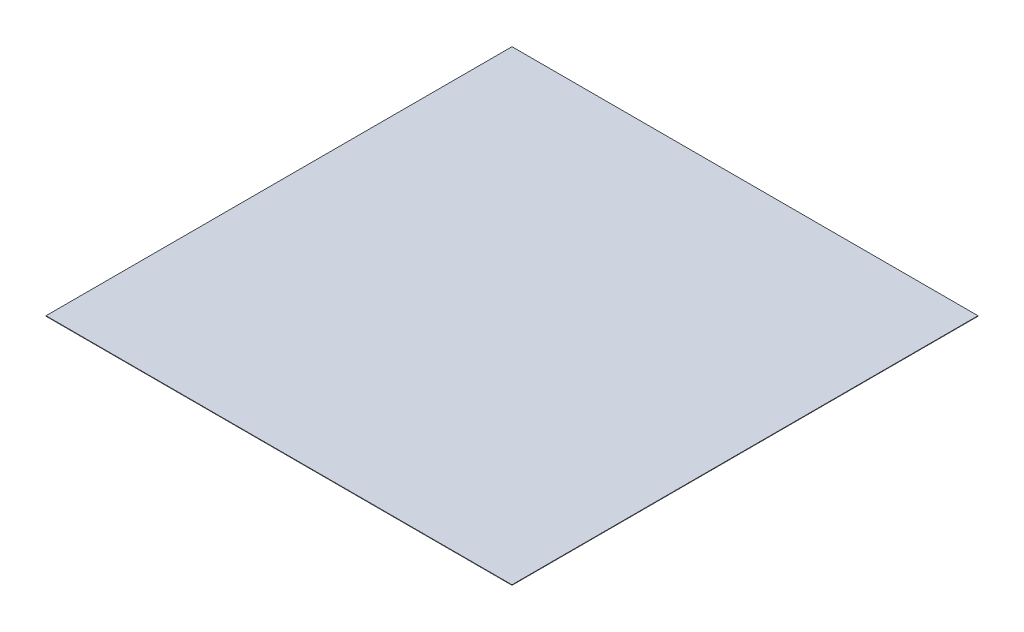
ISO-10303-21;
HEADER;
FILE_DESCRIPTION(('STEP AP214'),'2;1');
FILE_NAME('part.step','',(''),(''),'','','');
FILE_SCHEMA(('AUTOMOTIVE_DESIGN { 1 0 10303 214 1 1 1 1 }'));
ENDSEC;
DATA;
#1=APPLICATION_CONTEXT('core data for automotive mechanical design processes');
#2=APPLICATION_PROTOCOL_DEFINITION('international standard','automotive_design',2000,#1);
#3=PRODUCT_CONTEXT('',#1,'mechanical');
#4=PRODUCT('Part','Part','',(#3));
#5=PRODUCT_RELATED_PRODUCT_CATEGORY('part','',(#4));
#6=PRODUCT_DEFINITION_FORMATION('','',#4);
#7=PRODUCT_DEFINITION_CONTEXT('part definition',#1,'design');
#8=PRODUCT_DEFINITION('design','',#6,#7);
#9=PRODUCT_DEFINITION_SHAPE('','',#8);
#10=(LENGTH_UNIT() NAMED_UNIT(*) SI_UNIT(.MILLI.,.METRE.));
#11=(NAMED_UNIT(*) PLANE_ANGLE_UNIT() SI_UNIT($,.RADIAN.));
#12=(NAMED_UNIT(*) SI_UNIT($,.STERADIAN.) SOLID_ANGLE_UNIT());
#13=UNCERTAINTY_MEASURE_WITH_UNIT(LENGTH_MEASURE(1.E-05),#10,'distance_accuracy_value','');
#14=(GEOMETRIC_REPRESENTATION_CONTEXT(3) GLOBAL_UNCERTAINTY_ASSIGNED_CONTEXT((#13)) GLOBAL_UNIT_ASSIGNED_CONTEXT((#10,
#11,#12)) REPRESENTATION_CONTEXT('',''));
#15=CARTESIAN_POINT('',(0.,0.,0.));
#16=DIRECTION('',(0.,0.,1.));
#17=DIRECTION('',(1.,0.,0.));
#18=AXIS2_PLACEMENT_3D('',#15,#16,#17);
#19=CARTESIAN_POINT('',(5000.,-10.,-5000.));
#20=DIRECTION('',(1.,0.,0.));
#21=DIRECTION('',(0.,0.,-1.));
#22=AXIS2_PLACEMENT_3D('',#19,#20,#21);
#23=PLANE('',#22);
#24=DIRECTION('',(0.,0.,-1.));
#25=VECTOR('',#24,1.);
#26=CARTESIAN_POINT('',(5000.,0.,-5000.));
#27=LINE('',#26,#25);
#28=CARTESIAN_POINT('',(5000.,0.,5000.));
#29=VERTEX_POINT('',#28);
#30=CARTESIAN_POINT('',(5000.,0.,-5000.));
#31=VERTEX_POINT('',#30);
#32=EDGE_CURVE('E97',#29,#31,#27,.T.);
#33=ORIENTED_EDGE('',*,*,#32,.F.);
#34=DIRECTION('',(0.,1.,0.));
#35=VECTOR('',#34,1.);
#36=CARTESIAN_POINT('',(5000.,-10.,5000.));
#37=LINE('',#36,#35);
#38=CARTESIAN_POINT('',(5000.,-10.,5000.));
#39=VERTEX_POINT('',#38);
#40=EDGE_CURVE('E11',#39,#29,#37,.T.);
#41=ORIENTED_EDGE('',*,*,#40,.F.);
#42=DIRECTION('',(0.,0.,-1.));
#43=VECTOR('',#42,1.);
#44=CARTESIAN_POINT('',(5000.,-10.,-5000.));
#45=LINE('',#44,#43);
#46=CARTESIAN_POINT('',(5000.,-10.,-5000.));
#47=VERTEX_POINT('',#46);
#48=EDGE_CURVE('E91',#39,#47,#45,.T.);
#49=ORIENTED_EDGE('',*,*,#48,.T.);
#50=DIRECTION('',(0.,1.,0.));
#51=VECTOR('',#50,1.);
#52=CARTESIAN_POINT('',(5000.,-10.,-5000.));
#53=LINE('',#52,#51);
#54=EDGE_CURVE('E36',#47,#31,#53,.T.);
#55=ORIENTED_EDGE('',*,*,#54,.T.);
#56=EDGE_LOOP('',(#33,#41,#49,#55));
#57=FACE_BOUND('',#56,.T.);
#58=ADVANCED_FACE('F33',(#57),#23,.T.);
#59=CARTESIAN_POINT('',(-5000.,-10.,5000.));
#60=DIRECTION('',(0.,0.,1.));
#61=DIRECTION('',(1.,0.,0.));
#62=AXIS2_PLACEMENT_3D('',#59,#60,#61);
#63=PLANE('',#62);
#64=DIRECTION('',(1.,0.,0.));
#65=VECTOR('',#64,1.);
#66=CARTESIAN_POINT('',(-5000.,0.,5000.));
#67=LINE('',#66,#65);
#68=CARTESIAN_POINT('',(-5000.,0.,5000.));
#69=VERTEX_POINT('',#68);
#70=EDGE_CURVE('E93',#69,#29,#67,.T.);
#71=ORIENTED_EDGE('',*,*,#70,.F.);
#72=DIRECTION('',(0.,1.,0.));
#73=VECTOR('',#72,1.);
#74=CARTESIAN_POINT('',(-5000.,-10.,5000.));
#75=LINE('',#74,#73);
#76=CARTESIAN_POINT('',(-5000.,-10.,5000.));
#77=VERTEX_POINT('',#76);
#78=EDGE_CURVE('E42',#77,#69,#75,.T.);
#79=ORIENTED_EDGE('',*,*,#78,.F.);
#80=DIRECTION('',(1.,0.,0.));
#81=VECTOR('',#80,1.);
#82=CARTESIAN_POINT('',(-5000.,-10.,5000.));
#83=LINE('',#82,#81);
#84=EDGE_CURVE('E88',#77,#39,#83,.T.);
#85=ORIENTED_EDGE('',*,*,#84,.T.);
#86=ORIENTED_EDGE('',*,*,#40,.T.);
#87=EDGE_LOOP('',(#71,#79,#85,#86));
#88=FACE_BOUND('',#87,.T.);
#89=ADVANCED_FACE('F107',(#88),#63,.T.);
#90=CARTESIAN_POINT('',(-5000.,-10.,-5000.));
#91=DIRECTION('',(-1.,0.,0.));
#92=DIRECTION('',(0.,0.,1.));
#93=AXIS2_PLACEMENT_3D('',#90,#91,#92);
#94=PLANE('',#93);
#95=DIRECTION('',(0.,0.,1.));
#96=VECTOR('',#95,1.);
#97=CARTESIAN_POINT('',(-5000.,0.,-5000.));
#98=LINE('',#97,#96);
#99=CARTESIAN_POINT('',(-5000.,0.,-5000.));
#100=VERTEX_POINT('',#99);
#101=EDGE_CURVE('E83',#100,#69,#98,.T.);
#102=ORIENTED_EDGE('',*,*,#101,.F.);
#103=DIRECTION('',(0.,1.,0.));
#104=VECTOR('',#103,1.);
#105=CARTESIAN_POINT('',(-5000.,-10.,-5000.));
#106=LINE('',#105,#104);
#107=CARTESIAN_POINT('',(-5000.,-10.,-5000.));
#108=VERTEX_POINT('',#107);
#109=EDGE_CURVE('E78',#108,#100,#106,.T.);
#110=ORIENTED_EDGE('',*,*,#109,.F.);
#111=DIRECTION('',(0.,0.,1.));
#112=VECTOR('',#111,1.);
#113=CARTESIAN_POINT('',(-5000.,-10.,-5000.));
#114=LINE('',#113,#112);
#115=EDGE_CURVE('E81',#108,#77,#114,.T.);
#116=ORIENTED_EDGE('',*,*,#115,.T.);
#117=ORIENTED_EDGE('',*,*,#78,.T.);
#118=EDGE_LOOP('',(#102,#110,#116,#117));
#119=FACE_BOUND('',#118,.T.);
#120=ADVANCED_FACE('F80',(#119),#94,.T.);
#121=CARTESIAN_POINT('',(-5000.,-10.,-5000.));
#122=DIRECTION('',(0.,0.,-1.));
#123=DIRECTION('',(-1.,0.,0.));
#124=AXIS2_PLACEMENT_3D('',#121,#122,#123);
#125=PLANE('',#124);
#126=DIRECTION('',(-1.,0.,0.));
#127=VECTOR('',#126,1.);
#128=CARTESIAN_POINT('',(-5000.,0.,-5000.));
#129=LINE('',#128,#127);
#130=EDGE_CURVE('E100',#31,#100,#129,.T.);
#131=ORIENTED_EDGE('',*,*,#130,.F.);
#132=ORIENTED_EDGE('',*,*,#54,.F.);
#133=DIRECTION('',(-1.,0.,0.));
#134=VECTOR('',#133,1.);
#135=CARTESIAN_POINT('',(-5000.,-10.,-5000.));
#136=LINE('',#135,#134);
#137=EDGE_CURVE('E87',#47,#108,#136,.T.);
#138=ORIENTED_EDGE('',*,*,#137,.T.);
#139=ORIENTED_EDGE('',*,*,#109,.T.);
#140=EDGE_LOOP('',(#131,#132,#138,#139));
#141=FACE_BOUND('',#140,.T.);
#142=ADVANCED_FACE('F90',(#141),#125,.T.);
#143=CARTESIAN_POINT('',(0.,-10.,0.));
#144=DIRECTION('',(0.,1.,0.));
#145=DIRECTION('',(0.,0.,1.));
#146=AXIS2_PLACEMENT_3D('',#143,#144,#145);
#147=PLANE('',#146);
#148=ORIENTED_EDGE('',*,*,#48,.F.);
#149=ORIENTED_EDGE('',*,*,#84,.F.);
#150=ORIENTED_EDGE('',*,*,#115,.F.);
#151=ORIENTED_EDGE('',*,*,#137,.F.);
#152=EDGE_LOOP('',(#148,#149,#150,#151));
#153=FACE_BOUND('',#152,.T.);
#154=ADVANCED_FACE('F86',(#153),#147,.F.);
#155=CARTESIAN_POINT('',(0.,0.,0.));
#156=DIRECTION('',(0.,1.,0.));
#157=DIRECTION('',(0.,0.,1.));
#158=AXIS2_PLACEMENT_3D('',#155,#156,#157);
#159=PLANE('',#158);
#160=ORIENTED_EDGE('',*,*,#32,.T.);
#161=ORIENTED_EDGE('',*,*,#130,.T.);
#162=ORIENTED_EDGE('',*,*,#101,.T.);
#163=ORIENTED_EDGE('',*,*,#70,.T.);
#164=EDGE_LOOP('',(#160,#161,#162,#163));
#165=FACE_BOUND('',#164,.T.);
#166=ADVANCED_FACE('F106',(#165),#159,.T.);
#167=CLOSED_SHELL('',(#58,#89,#120,#142,#154,#166));
#168=MANIFOLD_SOLID_BREP('B2',#167);
#169=ADVANCED_BREP_SHAPE_REPRESENTATION('',(#18,#168),#14);
#170=SHAPE_DEFINITION_REPRESENTATION(#9,#169);
ENDSEC;
END-ISO-10303-21;
